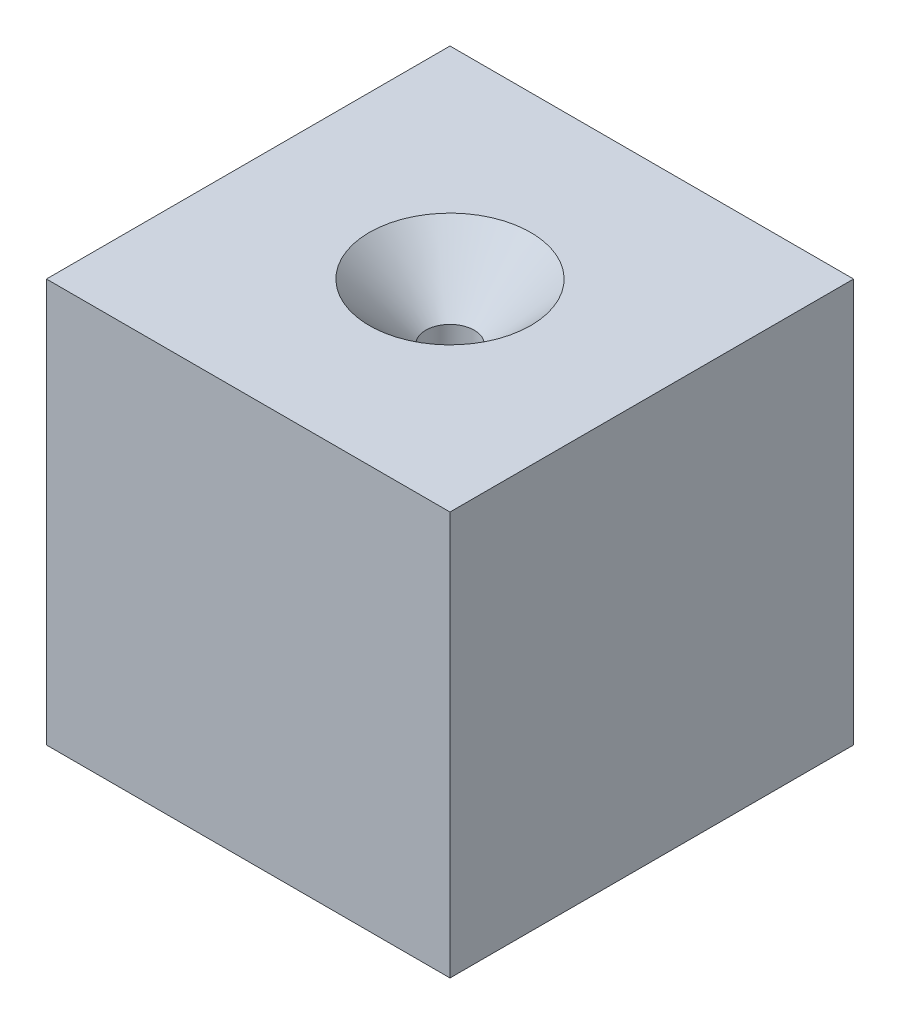
ISO-10303-21;
HEADER;
FILE_DESCRIPTION(('STEP AP214'),'2;1');
FILE_NAME('part.step','',(''),(''),'','','');
FILE_SCHEMA(('AUTOMOTIVE_DESIGN { 1 0 10303 214 1 1 1 1 }'));
ENDSEC;
DATA;
#1=APPLICATION_CONTEXT('core data for automotive mechanical design processes');
#2=APPLICATION_PROTOCOL_DEFINITION('international standard','automotive_design',2000,#1);
#3=PRODUCT_CONTEXT('',#1,'mechanical');
#4=PRODUCT('Part','Part','',(#3));
#5=PRODUCT_RELATED_PRODUCT_CATEGORY('part','',(#4));
#6=PRODUCT_DEFINITION_FORMATION('','',#4);
#7=PRODUCT_DEFINITION_CONTEXT('part definition',#1,'design');
#8=PRODUCT_DEFINITION('design','',#6,#7);
#9=PRODUCT_DEFINITION_SHAPE('','',#8);
#10=(LENGTH_UNIT() NAMED_UNIT(*) SI_UNIT(.MILLI.,.METRE.));
#11=(NAMED_UNIT(*) PLANE_ANGLE_UNIT() SI_UNIT($,.RADIAN.));
#12=(NAMED_UNIT(*) SI_UNIT($,.STERADIAN.) SOLID_ANGLE_UNIT());
#13=UNCERTAINTY_MEASURE_WITH_UNIT(LENGTH_MEASURE(1.E-05),#10,'distance_accuracy_value','');
#14=(GEOMETRIC_REPRESENTATION_CONTEXT(3) GLOBAL_UNCERTAINTY_ASSIGNED_CONTEXT((#13)) GLOBAL_UNIT_ASSIGNED_CONTEXT((#10,
#11,#12)) REPRESENTATION_CONTEXT('',''));
#15=CARTESIAN_POINT('',(0.,0.,0.));
#16=DIRECTION('',(0.,0.,1.));
#17=DIRECTION('',(1.,0.,0.));
#18=AXIS2_PLACEMENT_3D('',#15,#16,#17);
#19=CARTESIAN_POINT('',(13.9035657616335,20.5882352941176,50.));
#20=DIRECTION('',(-1.,0.,0.));
#21=DIRECTION('',(0.,-1.,0.));
#22=AXIS2_PLACEMENT_3D('',#19,#20,#21);
#23=PLANE('',#22);
#24=DIRECTION('',(0.,1.,0.));
#25=VECTOR('',#24,1.);
#26=CARTESIAN_POINT('',(13.9035657616335,20.5882352941176,0.));
#27=LINE('',#26,#25);
#28=CARTESIAN_POINT('',(13.9035657616335,-29.4117647058824,0.));
#29=VERTEX_POINT('',#28);
#30=CARTESIAN_POINT('',(13.9035657616335,20.5882352941176,0.));
#31=VERTEX_POINT('',#30);
#32=EDGE_CURVE('E109',#29,#31,#27,.T.);
#33=ORIENTED_EDGE('',*,*,#32,.T.);
#34=DIRECTION('',(0.,0.,-1.));
#35=VECTOR('',#34,1.);
#36=CARTESIAN_POINT('',(13.9035657616335,20.5882352941176,50.));
#37=LINE('',#36,#35);
#38=CARTESIAN_POINT('',(13.9035657616335,20.5882352941176,50.));
#39=VERTEX_POINT('',#38);
#40=EDGE_CURVE('E11',#39,#31,#37,.T.);
#41=ORIENTED_EDGE('',*,*,#40,.F.);
#42=DIRECTION('',(0.,1.,0.));
#43=VECTOR('',#42,1.);
#44=CARTESIAN_POINT('',(13.9035657616335,20.5882352941176,50.));
#45=LINE('',#44,#43);
#46=CARTESIAN_POINT('',(13.9035657616335,-29.4117647058824,50.));
#47=VERTEX_POINT('',#46);
#48=EDGE_CURVE('E93',#47,#39,#45,.T.);
#49=ORIENTED_EDGE('',*,*,#48,.F.);
#50=DIRECTION('',(0.,0.,-1.));
#51=VECTOR('',#50,1.);
#52=CARTESIAN_POINT('',(13.9035657616335,-29.4117647058824,50.));
#53=LINE('',#52,#51);
#54=EDGE_CURVE('E105',#47,#29,#53,.T.);
#55=ORIENTED_EDGE('',*,*,#54,.T.);
#56=EDGE_LOOP('',(#33,#41,#49,#55));
#57=FACE_BOUND('',#56,.T.);
#58=ADVANCED_FACE('F41',(#57),#23,.F.);
#59=CARTESIAN_POINT('',(-36.0964342383665,20.5882352941176,50.));
#60=DIRECTION('',(0.,-1.,0.));
#61=DIRECTION('',(0.,0.,-1.));
#62=AXIS2_PLACEMENT_3D('',#59,#60,#61);
#63=PLANE('',#62);
#64=CARTESIAN_POINT('',(-11.0964342383665,20.5882352941176,25.));
#65=DIRECTION('',(0.,1.,0.));
#66=DIRECTION('',(-1.,0.,0.));
#67=AXIS2_PLACEMENT_3D('',#64,#65,#66);
#68=CIRCLE('',#67,10.);
#69=CARTESIAN_POINT('',(-21.0964342383665,20.5882352941176,25.));
#70=VERTEX_POINT('',#69);
#71=EDGE_CURVE('E137',#70,#70,#68,.T.);
#72=ORIENTED_EDGE('',*,*,#71,.F.);
#73=EDGE_LOOP('',(#72));
#74=FACE_BOUND('',#73,.T.);
#75=DIRECTION('',(-1.,0.,0.));
#76=VECTOR('',#75,1.);
#77=CARTESIAN_POINT('',(-36.0964342383665,20.5882352941176,0.));
#78=LINE('',#77,#76);
#79=CARTESIAN_POINT('',(-36.0964342383665,20.5882352941176,0.));
#80=VERTEX_POINT('',#79);
#81=EDGE_CURVE('E98',#31,#80,#78,.T.);
#82=ORIENTED_EDGE('',*,*,#81,.T.);
#83=DIRECTION('',(0.,0.,-1.));
#84=VECTOR('',#83,1.);
#85=CARTESIAN_POINT('',(-36.0964342383665,20.5882352941176,50.));
#86=LINE('',#85,#84);
#87=CARTESIAN_POINT('',(-36.0964342383665,20.5882352941176,50.));
#88=VERTEX_POINT('',#87);
#89=EDGE_CURVE('E50',#88,#80,#86,.T.);
#90=ORIENTED_EDGE('',*,*,#89,.F.);
#91=DIRECTION('',(-1.,0.,0.));
#92=VECTOR('',#91,1.);
#93=CARTESIAN_POINT('',(-36.0964342383665,20.5882352941176,50.));
#94=LINE('',#93,#92);
#95=EDGE_CURVE('E88',#39,#88,#94,.T.);
#96=ORIENTED_EDGE('',*,*,#95,.F.);
#97=ORIENTED_EDGE('',*,*,#40,.T.);
#98=EDGE_LOOP('',(#82,#90,#96,#97));
#99=FACE_BOUND('',#98,.T.);
#100=ADVANCED_FACE('F97',(#74,#99),#63,.F.);
#101=CARTESIAN_POINT('',(-36.0964342383665,20.5882352941176,50.));
#102=DIRECTION('',(1.,0.,0.));
#103=DIRECTION('',(0.,1.,0.));
#104=AXIS2_PLACEMENT_3D('',#101,#102,#103);
#105=PLANE('',#104);
#106=DIRECTION('',(0.,-1.,0.));
#107=VECTOR('',#106,1.);
#108=CARTESIAN_POINT('',(-36.0964342383665,20.5882352941176,0.));
#109=LINE('',#108,#107);
#110=CARTESIAN_POINT('',(-36.0964342383665,-29.4117647058824,0.));
#111=VERTEX_POINT('',#110);
#112=EDGE_CURVE('E75',#80,#111,#109,.T.);
#113=ORIENTED_EDGE('',*,*,#112,.T.);
#114=DIRECTION('',(0.,0.,-1.));
#115=VECTOR('',#114,1.);
#116=CARTESIAN_POINT('',(-36.0964342383665,-29.4117647058824,50.));
#117=LINE('',#116,#115);
#118=CARTESIAN_POINT('',(-36.0964342383665,-29.4117647058824,50.));
#119=VERTEX_POINT('',#118);
#120=EDGE_CURVE('E100',#119,#111,#117,.T.);
#121=ORIENTED_EDGE('',*,*,#120,.F.);
#122=DIRECTION('',(0.,-1.,0.));
#123=VECTOR('',#122,1.);
#124=CARTESIAN_POINT('',(-36.0964342383665,20.5882352941176,50.));
#125=LINE('',#124,#123);
#126=EDGE_CURVE('E91',#88,#119,#125,.T.);
#127=ORIENTED_EDGE('',*,*,#126,.F.);
#128=ORIENTED_EDGE('',*,*,#89,.T.);
#129=EDGE_LOOP('',(#113,#121,#127,#128));
#130=FACE_BOUND('',#129,.T.);
#131=ADVANCED_FACE('F101',(#130),#105,.F.);
#132=CARTESIAN_POINT('',(-36.0964342383665,-29.4117647058824,50.));
#133=DIRECTION('',(0.,1.,0.));
#134=DIRECTION('',(0.,0.,1.));
#135=AXIS2_PLACEMENT_3D('',#132,#133,#134);
#136=PLANE('',#135);
#137=CARTESIAN_POINT('',(-11.0964342383665,-29.4117647058824,25.));
#138=DIRECTION('',(0.,1.,0.));
#139=DIRECTION('',(-1.,0.,0.));
#140=AXIS2_PLACEMENT_3D('',#137,#138,#139);
#141=CIRCLE('',#140,2.99999999999999);
#142=CARTESIAN_POINT('',(-14.0964342383665,-29.4117647058824,25.));
#143=VERTEX_POINT('',#142);
#144=EDGE_CURVE('E113',#143,#143,#141,.T.);
#145=ORIENTED_EDGE('',*,*,#144,.T.);
#146=EDGE_LOOP('',(#145));
#147=FACE_BOUND('',#146,.T.);
#148=DIRECTION('',(1.,0.,0.));
#149=VECTOR('',#148,1.);
#150=CARTESIAN_POINT('',(-36.0964342383665,-29.4117647058824,0.));
#151=LINE('',#150,#149);
#152=EDGE_CURVE('E81',#111,#29,#151,.T.);
#153=ORIENTED_EDGE('',*,*,#152,.T.);
#154=ORIENTED_EDGE('',*,*,#54,.F.);
#155=DIRECTION('',(1.,0.,0.));
#156=VECTOR('',#155,1.);
#157=CARTESIAN_POINT('',(-36.0964342383665,-29.4117647058824,50.));
#158=LINE('',#157,#156);
#159=EDGE_CURVE('E58',#119,#47,#158,.T.);
#160=ORIENTED_EDGE('',*,*,#159,.F.);
#161=ORIENTED_EDGE('',*,*,#120,.T.);
#162=EDGE_LOOP('',(#153,#154,#160,#161));
#163=FACE_BOUND('',#162,.T.);
#164=ADVANCED_FACE('F123',(#147,#163),#136,.F.);
#165=CARTESIAN_POINT('',(0.,0.,50.));
#166=DIRECTION('',(0.,0.,1.));
#167=DIRECTION('',(1.,0.,0.));
#168=AXIS2_PLACEMENT_3D('',#165,#166,#167);
#169=PLANE('',#168);
#170=ORIENTED_EDGE('',*,*,#48,.T.);
#171=ORIENTED_EDGE('',*,*,#95,.T.);
#172=ORIENTED_EDGE('',*,*,#126,.T.);
#173=ORIENTED_EDGE('',*,*,#159,.T.);
#174=EDGE_LOOP('',(#170,#171,#172,#173));
#175=FACE_BOUND('',#174,.T.);
#176=ADVANCED_FACE('F89',(#175),#169,.T.);
#177=CARTESIAN_POINT('',(0.,0.,0.));
#178=DIRECTION('',(0.,0.,1.));
#179=DIRECTION('',(1.,0.,0.));
#180=AXIS2_PLACEMENT_3D('',#177,#178,#179);
#181=PLANE('',#180);
#182=ORIENTED_EDGE('',*,*,#32,.F.);
#183=ORIENTED_EDGE('',*,*,#152,.F.);
#184=ORIENTED_EDGE('',*,*,#112,.F.);
#185=ORIENTED_EDGE('',*,*,#81,.F.);
#186=EDGE_LOOP('',(#182,#183,#184,#185));
#187=FACE_BOUND('',#186,.T.);
#188=ADVANCED_FACE('F126',(#187),#181,.F.);
#189=CARTESIAN_POINT('',(-11.0964342383665,20.5882352941176,25.));
#190=DIRECTION('',(0.,1.,0.));
#191=DIRECTION('',(-1.,0.,0.));
#192=AXIS2_PLACEMENT_3D('',#189,#190,#191);
#193=CYLINDRICAL_SURFACE('',#192,2.99999999999999);
#194=ORIENTED_EDGE('',*,*,#144,.F.);
#195=EDGE_LOOP('',(#194));
#196=FACE_BOUND('',#195,.T.);
#197=CARTESIAN_POINT('',(-11.0964342383665,13.5983191888682,25.));
#198=DIRECTION('',(0.,1.,0.));
#199=DIRECTION('',(-1.,0.,0.));
#200=AXIS2_PLACEMENT_3D('',#197,#198,#199);
#201=CIRCLE('',#200,3.);
#202=CARTESIAN_POINT('',(-14.0964342383665,13.5983191888682,25.));
#203=VERTEX_POINT('',#202);
#204=EDGE_CURVE('E133',#203,#203,#201,.T.);
#205=ORIENTED_EDGE('',*,*,#204,.T.);
#206=EDGE_LOOP('',(#205));
#207=FACE_BOUND('',#206,.T.);
#208=ADVANCED_FACE('F156',(#196,#207),#193,.F.);
#209=CARTESIAN_POINT('',(-11.0964342383665,20.5882352941176,25.));
#210=DIRECTION('',(0.,1.,0.));
#211=DIRECTION('',(-1.,0.,0.));
#212=AXIS2_PLACEMENT_3D('',#209,#210,#211);
#213=CONICAL_SURFACE('',#212,10.,0.786118960643718);
#214=CARTESIAN_POINT('',(-14.0964342383665,13.5983191888682,25.));
#215=CARTESIAN_POINT('',(-14.1693509050332,13.6711308149645,25.));
#216=CARTESIAN_POINT('',(-14.2422675716999,13.7439424410609,25.));
#217=CARTESIAN_POINT('',(-14.3881009050332,13.8895656932536,25.));
#218=CARTESIAN_POINT('',(-14.4610175716999,13.9623773193499,25.));
#219=CARTESIAN_POINT('',(-14.6068509050332,14.1080005715426,25.));
#220=CARTESIAN_POINT('',(-14.6797675716999,14.180812197639,25.));
#221=CARTESIAN_POINT('',(-14.8256009050332,14.3264354498317,25.));
#222=CARTESIAN_POINT('',(-14.8985175716999,14.399247075928,25.));
#223=CARTESIAN_POINT('',(-15.0443509050332,14.5448703281207,25.));
#224=CARTESIAN_POINT('',(-15.1172675716999,14.6176819542171,25.));
#225=CARTESIAN_POINT('',(-15.2631009050332,14.7633052064098,25.));
#226=CARTESIAN_POINT('',(-15.3360175716999,14.8361168325061,25.));
#227=CARTESIAN_POINT('',(-15.4818509050332,14.9817400846988,25.));
#228=CARTESIAN_POINT('',(-15.5547675716999,15.0545517107952,25.));
#229=CARTESIAN_POINT('',(-15.7006009050332,15.2001749629879,25.));
#230=CARTESIAN_POINT('',(-15.7735175716999,15.2729865890842,25.));
#231=CARTESIAN_POINT('',(-15.9193509050332,15.4186098412769,25.));
#232=CARTESIAN_POINT('',(-15.9922675716999,15.4914214673732,25.));
#233=CARTESIAN_POINT('',(-16.1381009050332,15.6370447195659,25.));
#234=CARTESIAN_POINT('',(-16.2110175716999,15.7098563456623,25.));
#235=CARTESIAN_POINT('',(-16.3568509050332,15.855479597855,25.));
#236=CARTESIAN_POINT('',(-16.4297675716999,15.9282912239513,25.));
#237=CARTESIAN_POINT('',(-16.5756009050332,16.073914476144,25.));
#238=CARTESIAN_POINT('',(-16.6485175716999,16.1467261022404,25.));
#239=CARTESIAN_POINT('',(-16.7943509050332,16.2923493544331,25.));
#240=CARTESIAN_POINT('',(-16.8672675716999,16.3651609805294,25.));
#241=CARTESIAN_POINT('',(-17.0131009050332,16.5107842327221,25.));
#242=CARTESIAN_POINT('',(-17.0860175716999,16.5835958588185,25.));
#243=CARTESIAN_POINT('',(-17.2318509050332,16.7292191110112,25.));
#244=CARTESIAN_POINT('',(-17.3047675716999,16.8020307371075,25.));
#245=CARTESIAN_POINT('',(-17.4506009050332,16.9476539893002,25.));
#246=CARTESIAN_POINT('',(-17.5235175716999,17.0204656153966,25.));
#247=CARTESIAN_POINT('',(-17.6693509050332,17.1660888675893,25.));
#248=CARTESIAN_POINT('',(-17.7422675716999,17.2389004936856,25.));
#249=CARTESIAN_POINT('',(-17.8881009050332,17.3845237458783,25.));
#250=CARTESIAN_POINT('',(-17.9610175716999,17.4573353719747,25.));
#251=CARTESIAN_POINT('',(-18.1068509050332,17.6029586241673,25.));
#252=CARTESIAN_POINT('',(-18.1797675716999,17.6757702502637,25.));
#253=CARTESIAN_POINT('',(-18.3256009050332,17.8213935024564,25.));
#254=CARTESIAN_POINT('',(-18.3985175716999,17.8942051285527,25.));
#255=CARTESIAN_POINT('',(-18.5443509050332,18.0398283807454,25.));
#256=CARTESIAN_POINT('',(-18.6172675716999,18.1126400068418,25.));
#257=CARTESIAN_POINT('',(-18.7631009050332,18.2582632590345,25.));
#258=CARTESIAN_POINT('',(-18.8360175716999,18.3310748851308,25.));
#259=CARTESIAN_POINT('',(-18.9818509050332,18.4766981373235,25.));
#260=CARTESIAN_POINT('',(-19.0547675716999,18.5495097634199,25.));
#261=CARTESIAN_POINT('',(-19.2006009050332,18.6951330156126,25.));
#262=CARTESIAN_POINT('',(-19.2735175716999,18.7679446417089,25.));
#263=CARTESIAN_POINT('',(-19.4193509050332,18.9135678939016,25.));
#264=CARTESIAN_POINT('',(-19.4922675716999,18.986379519998,25.));
#265=CARTESIAN_POINT('',(-19.6381009050332,19.1320027721907,25.));
#266=CARTESIAN_POINT('',(-19.7110175716999,19.204814398287,25.));
#267=CARTESIAN_POINT('',(-19.8568509050332,19.3504376504797,25.));
#268=CARTESIAN_POINT('',(-19.9297675716999,19.4232492765761,25.));
#269=CARTESIAN_POINT('',(-20.0756009050332,19.5688725287688,25.));
#270=CARTESIAN_POINT('',(-20.1485175716999,19.6416841548651,25.));
#271=CARTESIAN_POINT('',(-20.2943509050332,19.7873074070578,25.));
#272=CARTESIAN_POINT('',(-20.3672675716999,19.8601190331541,25.));
#273=CARTESIAN_POINT('',(-20.5131009050332,20.0057422853468,25.));
#274=CARTESIAN_POINT('',(-20.5860175716999,20.0785539114432,25.));
#275=CARTESIAN_POINT('',(-20.7318509050332,20.2241771636359,25.));
#276=CARTESIAN_POINT('',(-20.8047675716999,20.2969887897322,25.));
#277=CARTESIAN_POINT('',(-20.9506009050332,20.4426120419249,25.));
#278=CARTESIAN_POINT('',(-21.0235175716999,20.5154236680213,25.));
#279=CARTESIAN_POINT('',(-21.0964342383665,20.5882352941176,25.));
#280=B_SPLINE_CURVE_WITH_KNOTS('',3,(#214,#215,#216,#217,#218,#219,#220,#221,#222,#223,#224,
#225,#226,#227,#228,#229,#230,#231,#232,#233,#234,#235,#236,#237,#238,#239,#240,#241,#242,#243,
#244,#245,#246,#247,#248,#249,#250,#251,#252,#253,#254,#255,#256,#257,#258,#259,#260,#261,#262,
#263,#264,#265,#266,#267,#268,#269,#270,#271,#272,#273,#274,#275,#276,#277,#278,#279),
.UNSPECIFIED.,.F.,.F.,(4,2,2,2,2,2,2,2,2,2,2,2,2,2,2,2,2,2,2,2,2,2,2,2,2,2,2,2,2,2,2,2,4),(0.,
0.309136472376118,0.618272944752234,0.927409417128351,1.23654588950447,1.54568236188059,
1.85481883425671,2.16395530663282,2.47309177900894,2.78222825138506,3.09136472376118,
3.4005011961373,3.70963766851341,4.01877414088953,4.32791061326565,4.63704708564177,
4.94618355801788,5.255320030394,5.56445650277012,5.87359297514624,6.18272944752235,
6.49186591989847,6.80100239227459,7.11013886465071,7.41927533702682,7.72841180940295,
8.03754828177906,8.34668475415518,8.65582122653129,8.96495769890742,9.27409417128353,
9.58323064365965,9.89236711603576),.UNSPECIFIED.);
#281=EDGE_CURVE('BSEAM142',#203,#70,#280,.T.);
#282=ORIENTED_EDGE('',*,*,#204,.F.);
#283=ORIENTED_EDGE('',*,*,#71,.T.);
#284=ORIENTED_EDGE('',*,*,#281,.T.);
#285=ORIENTED_EDGE('',*,*,#281,.F.);
#286=EDGE_LOOP('',(#282,#284,#283,#285));
#287=FACE_BOUND('',#286,.T.);
#288=ADVANCED_FACE('F142',(#287),#213,.F.);
#289=CLOSED_SHELL('',(#58,#100,#131,#164,#176,#188,#208,#288));
#290=MANIFOLD_SOLID_BREP('B2',#289);
#291=ADVANCED_BREP_SHAPE_REPRESENTATION('',(#18,#290),#14);
#292=SHAPE_DEFINITION_REPRESENTATION(#9,#291);
ENDSEC;
END-ISO-10303-21;
